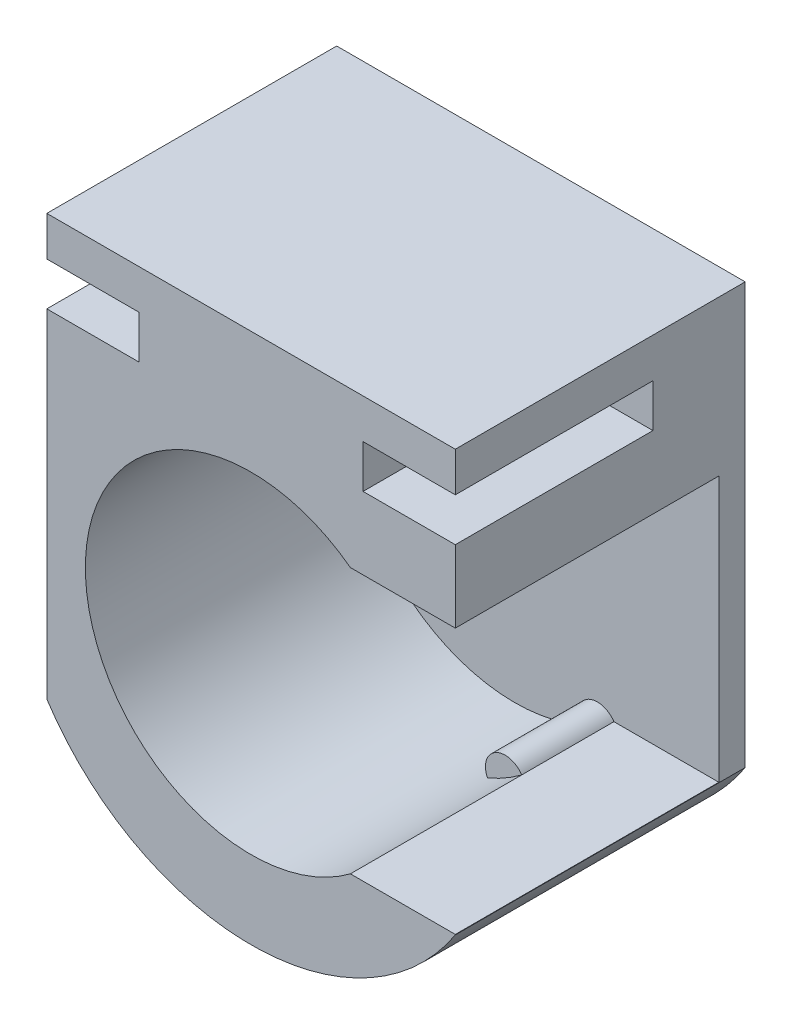
ISO-10303-21;
HEADER;
FILE_DESCRIPTION(('STEP AP214'),'2;1');
FILE_NAME('part.step','',(''),(''),'','','');
FILE_SCHEMA(('AUTOMOTIVE_DESIGN { 1 0 10303 214 1 1 1 1 }'));
ENDSEC;
DATA;
#1=APPLICATION_CONTEXT('core data for automotive mechanical design processes');
#2=APPLICATION_PROTOCOL_DEFINITION('international standard','automotive_design',2000,#1);
#3=PRODUCT_CONTEXT('',#1,'mechanical');
#4=PRODUCT('Part','Part','',(#3));
#5=PRODUCT_RELATED_PRODUCT_CATEGORY('part','',(#4));
#6=PRODUCT_DEFINITION_FORMATION('','',#4);
#7=PRODUCT_DEFINITION_CONTEXT('part definition',#1,'design');
#8=PRODUCT_DEFINITION('design','',#6,#7);
#9=PRODUCT_DEFINITION_SHAPE('','',#8);
#10=(LENGTH_UNIT() NAMED_UNIT(*) SI_UNIT(.MILLI.,.METRE.));
#11=(NAMED_UNIT(*) PLANE_ANGLE_UNIT() SI_UNIT($,.RADIAN.));
#12=(NAMED_UNIT(*) SI_UNIT($,.STERADIAN.) SOLID_ANGLE_UNIT());
#13=UNCERTAINTY_MEASURE_WITH_UNIT(LENGTH_MEASURE(1.E-05),#10,'distance_accuracy_value','');
#14=(GEOMETRIC_REPRESENTATION_CONTEXT(3) GLOBAL_UNCERTAINTY_ASSIGNED_CONTEXT((#13)) GLOBAL_UNIT_ASSIGNED_CONTEXT((#10,
#11,#12)) REPRESENTATION_CONTEXT('',''));
#15=CARTESIAN_POINT('',(0.,0.,0.));
#16=DIRECTION('',(0.,0.,1.));
#17=DIRECTION('',(1.,0.,0.));
#18=AXIS2_PLACEMENT_3D('',#15,#16,#17);
#19=CARTESIAN_POINT('',(0.,0.,15.));
#20=DIRECTION('',(0.,0.,-1.));
#21=DIRECTION('',(-1.,0.,0.));
#22=AXIS2_PLACEMENT_3D('',#19,#20,#21);
#23=CYLINDRICAL_SURFACE('',#22,12.575);
#24=CARTESIAN_POINT('',(0.,0.,2.));
#25=DIRECTION('',(0.,0.,1.));
#26=DIRECTION('',(1.,0.,0.));
#27=AXIS2_PLACEMENT_3D('',#24,#25,#26);
#28=CIRCLE('',#27,12.575);
#29=CARTESIAN_POINT('',(7.53949397709741,10.0641271638087,2.));
#30=VERTEX_POINT('',#29);
#31=CARTESIAN_POINT('',(4.94604280222658,11.5614568977505,2.));
#32=VERTEX_POINT('',#31);
#33=EDGE_CURVE('E42',#30,#32,#28,.T.);
#34=ORIENTED_EDGE('',*,*,#33,.F.);
#35=DIRECTION('',(0.,0.,1.));
#36=VECTOR('',#35,1.);
#37=CARTESIAN_POINT('',(7.53949397709741,10.0641271638087,-5.));
#38=LINE('',#37,#36);
#39=CARTESIAN_POINT('',(7.53949397709741,10.0641271638087,15.));
#40=VERTEX_POINT('',#39);
#41=EDGE_CURVE('E194',#30,#40,#38,.T.);
#42=ORIENTED_EDGE('',*,*,#41,.T.);
#43=CARTESIAN_POINT('',(0.,0.,15.));
#44=DIRECTION('',(0.,0.,1.));
#45=DIRECTION('',(1.,0.,0.));
#46=AXIS2_PLACEMENT_3D('',#43,#44,#45);
#47=CIRCLE('',#46,12.575);
#48=CARTESIAN_POINT('',(7.53949397709742,-10.0641271638087,15.));
#49=VERTEX_POINT('',#48);
#50=EDGE_CURVE('E301',#40,#49,#47,.T.);
#51=ORIENTED_EDGE('',*,*,#50,.T.);
#52=DIRECTION('',(0.,0.,1.));
#53=VECTOR('',#52,1.);
#54=CARTESIAN_POINT('',(7.53949397709742,-10.0641271638087,-5.));
#55=LINE('',#54,#53);
#56=CARTESIAN_POINT('',(7.53949397709742,-10.0641271638087,2.));
#57=VERTEX_POINT('',#56);
#58=EDGE_CURVE('E370',#57,#49,#55,.T.);
#59=ORIENTED_EDGE('',*,*,#58,.F.);
#60=CARTESIAN_POINT('',(0.,0.,2.));
#61=DIRECTION('',(0.,0.,1.));
#62=DIRECTION('',(1.,0.,0.));
#63=AXIS2_PLACEMENT_3D('',#60,#61,#62);
#64=CIRCLE('',#63,12.575);
#65=CARTESIAN_POINT('',(4.94604280222716,-11.5614568977503,2.));
#66=VERTEX_POINT('',#65);
#67=EDGE_CURVE('E11',#66,#57,#64,.T.);
#68=ORIENTED_EDGE('',*,*,#67,.F.);
#69=DIRECTION('',(0.,0.,-1.));
#70=VECTOR('',#69,1.);
#71=CARTESIAN_POINT('',(4.94604280222716,-11.5614568977503,-1.5));
#72=LINE('',#71,#70);
#73=CARTESIAN_POINT('',(4.94604280222716,-11.5614568977503,-5.));
#74=VERTEX_POINT('',#73);
#75=EDGE_CURVE('E215',#66,#74,#72,.T.);
#76=ORIENTED_EDGE('',*,*,#75,.T.);
#77=CARTESIAN_POINT('',(0.,0.,-5.));
#78=DIRECTION('',(0.,0.,-1.));
#79=DIRECTION('',(-1.,0.,0.));
#80=AXIS2_PLACEMENT_3D('',#77,#78,#79);
#81=CIRCLE('',#80,12.575);
#82=CARTESIAN_POINT('',(4.94604280222659,11.5614568977505,-5.));
#83=VERTEX_POINT('',#82);
#84=EDGE_CURVE('E254',#74,#83,#81,.T.);
#85=ORIENTED_EDGE('',*,*,#84,.T.);
#86=DIRECTION('',(0.,0.,-1.));
#87=VECTOR('',#86,1.);
#88=CARTESIAN_POINT('',(4.94604280222659,11.5614568977505,-1.5));
#89=LINE('',#88,#87);
#90=EDGE_CURVE('E201',#83,#32,#89,.F.);
#91=ORIENTED_EDGE('',*,*,#90,.T.);
#92=EDGE_LOOP('',(#34,#42,#51,#59,#68,#76,#85,#91));
#93=FACE_BOUND('',#92,.T.);
#94=ADVANCED_FACE('F34',(#93),#23,.F.);
#95=CARTESIAN_POINT('',(15.5,0.,15.));
#96=DIRECTION('',(-1.,0.,0.));
#97=DIRECTION('',(0.,0.,1.));
#98=AXIS2_PLACEMENT_3D('',#95,#96,#97);
#99=PLANE('',#98);
#100=DIRECTION('',(0.,0.,1.));
#101=VECTOR('',#100,1.);
#102=CARTESIAN_POINT('',(15.5,10.0641271638087,-5.));
#103=LINE('',#102,#101);
#104=CARTESIAN_POINT('',(15.5,10.0641271638087,-5.));
#105=VERTEX_POINT('',#104);
#106=CARTESIAN_POINT('',(15.5,10.0641271638087,15.));
#107=VERTEX_POINT('',#106);
#108=EDGE_CURVE('E367',#105,#107,#103,.T.);
#109=ORIENTED_EDGE('',*,*,#108,.F.);
#110=DIRECTION('',(0.,1.,0.));
#111=VECTOR('',#110,1.);
#112=CARTESIAN_POINT('',(15.5,0.,-5.));
#113=LINE('',#112,#111);
#114=CARTESIAN_POINT('',(15.5,-10.0641271638087,-5.));
#115=VERTEX_POINT('',#114);
#116=EDGE_CURVE('E209',#115,#105,#113,.T.);
#117=ORIENTED_EDGE('',*,*,#116,.F.);
#118=DIRECTION('',(0.,0.,1.));
#119=VECTOR('',#118,1.);
#120=CARTESIAN_POINT('',(15.5,-10.0641271638087,-5.));
#121=LINE('',#120,#119);
#122=CARTESIAN_POINT('',(15.5,-10.0641271638087,15.));
#123=VERTEX_POINT('',#122);
#124=EDGE_CURVE('E372',#115,#123,#121,.T.);
#125=ORIENTED_EDGE('',*,*,#124,.T.);
#126=DIRECTION('',(0.,1.,0.));
#127=VECTOR('',#126,1.);
#128=CARTESIAN_POINT('',(15.5,0.,15.));
#129=LINE('',#128,#127);
#130=CARTESIAN_POINT('',(15.5,-10.0995049383621,15.));
#131=VERTEX_POINT('',#130);
#132=EDGE_CURVE('E273',#131,#123,#129,.T.);
#133=ORIENTED_EDGE('',*,*,#132,.F.);
#134=DIRECTION('',(0.,0.,-1.));
#135=VECTOR('',#134,1.);
#136=CARTESIAN_POINT('',(15.5,-10.0995049383621,15.));
#137=LINE('',#136,#135);
#138=CARTESIAN_POINT('',(15.5,-10.0995049383621,-7.));
#139=VERTEX_POINT('',#138);
#140=EDGE_CURVE('E247',#131,#139,#137,.T.);
#141=ORIENTED_EDGE('',*,*,#140,.T.);
#142=DIRECTION('',(0.,-1.,0.));
#143=VECTOR('',#142,1.);
#144=CARTESIAN_POINT('',(15.5,0.,-7.));
#145=LINE('',#144,#143);
#146=CARTESIAN_POINT('',(15.5,21.825,-7.));
#147=VERTEX_POINT('',#146);
#148=EDGE_CURVE('E259',#147,#139,#145,.T.);
#149=ORIENTED_EDGE('',*,*,#148,.F.);
#150=DIRECTION('',(0.,0.,-1.));
#151=VECTOR('',#150,1.);
#152=CARTESIAN_POINT('',(15.5,21.825,15.));
#153=LINE('',#152,#151);
#154=CARTESIAN_POINT('',(15.5,21.825,15.));
#155=VERTEX_POINT('',#154);
#156=EDGE_CURVE('E331',#155,#147,#153,.T.);
#157=ORIENTED_EDGE('',*,*,#156,.F.);
#158=DIRECTION('',(0.,1.,0.));
#159=VECTOR('',#158,1.);
#160=CARTESIAN_POINT('',(15.5,0.,15.));
#161=LINE('',#160,#159);
#162=CARTESIAN_POINT('',(15.5,18.825,15.));
#163=VERTEX_POINT('',#162);
#164=EDGE_CURVE('E285',#163,#155,#161,.T.);
#165=ORIENTED_EDGE('',*,*,#164,.F.);
#166=DIRECTION('',(0.,0.,-1.));
#167=VECTOR('',#166,1.);
#168=CARTESIAN_POINT('',(15.5,18.825,15.));
#169=LINE('',#168,#167);
#170=CARTESIAN_POINT('',(15.5,18.825,0.));
#171=VERTEX_POINT('',#170);
#172=EDGE_CURVE('E333',#163,#171,#169,.T.);
#173=ORIENTED_EDGE('',*,*,#172,.T.);
#174=DIRECTION('',(0.,-1.,0.));
#175=VECTOR('',#174,1.);
#176=CARTESIAN_POINT('',(15.5,0.,0.));
#177=LINE('',#176,#175);
#178=CARTESIAN_POINT('',(15.5,15.55,0.));
#179=VERTEX_POINT('',#178);
#180=EDGE_CURVE('E258',#171,#179,#177,.T.);
#181=ORIENTED_EDGE('',*,*,#180,.T.);
#182=DIRECTION('',(0.,0.,-1.));
#183=VECTOR('',#182,1.);
#184=CARTESIAN_POINT('',(15.5,15.55,15.));
#185=LINE('',#184,#183);
#186=CARTESIAN_POINT('',(15.5,15.55,15.));
#187=VERTEX_POINT('',#186);
#188=EDGE_CURVE('E342',#187,#179,#185,.T.);
#189=ORIENTED_EDGE('',*,*,#188,.F.);
#190=EDGE_CURVE('E277',#107,#187,#129,.T.);
#191=ORIENTED_EDGE('',*,*,#190,.F.);
#192=EDGE_LOOP('',(#109,#117,#125,#133,#141,#149,#157,#165,#173,#181,#189,#191));
#193=FACE_BOUND('',#192,.T.);
#194=ADVANCED_FACE('F387',(#193),#99,.F.);
#195=CARTESIAN_POINT('',(0.,0.,15.));
#196=DIRECTION('',(0.,0.,1.));
#197=DIRECTION('',(1.,0.,0.));
#198=AXIS2_PLACEMENT_3D('',#195,#196,#197);
#199=PLANE('',#198);
#200=ORIENTED_EDGE('',*,*,#50,.F.);
#201=DIRECTION('',(1.,0.,0.));
#202=VECTOR('',#201,1.);
#203=CARTESIAN_POINT('',(0.,10.0641271638087,15.));
#204=LINE('',#203,#202);
#205=EDGE_CURVE('E377',#40,#107,#204,.T.);
#206=ORIENTED_EDGE('',*,*,#205,.T.);
#207=ORIENTED_EDGE('',*,*,#190,.T.);
#208=DIRECTION('',(-1.,0.,0.));
#209=VECTOR('',#208,1.);
#210=CARTESIAN_POINT('',(0.,15.55,15.));
#211=LINE('',#210,#209);
#212=CARTESIAN_POINT('',(8.5,15.55,15.));
#213=VERTEX_POINT('',#212);
#214=EDGE_CURVE('E276',#187,#213,#211,.T.);
#215=ORIENTED_EDGE('',*,*,#214,.T.);
#216=DIRECTION('',(0.,-1.,0.));
#217=VECTOR('',#216,1.);
#218=CARTESIAN_POINT('',(8.5,0.,15.));
#219=LINE('',#218,#217);
#220=CARTESIAN_POINT('',(8.5,18.825,15.));
#221=VERTEX_POINT('',#220);
#222=EDGE_CURVE('E279',#221,#213,#219,.T.);
#223=ORIENTED_EDGE('',*,*,#222,.F.);
#224=DIRECTION('',(1.,0.,0.));
#225=VECTOR('',#224,1.);
#226=CARTESIAN_POINT('',(0.,18.825,15.));
#227=LINE('',#226,#225);
#228=EDGE_CURVE('E283',#221,#163,#227,.T.);
#229=ORIENTED_EDGE('',*,*,#228,.T.);
#230=ORIENTED_EDGE('',*,*,#164,.T.);
#231=DIRECTION('',(1.,0.,0.));
#232=VECTOR('',#231,1.);
#233=CARTESIAN_POINT('',(0.,21.825,15.));
#234=LINE('',#233,#232);
#235=CARTESIAN_POINT('',(-15.5,21.825,15.));
#236=VERTEX_POINT('',#235);
#237=EDGE_CURVE('E287',#236,#155,#234,.T.);
#238=ORIENTED_EDGE('',*,*,#237,.F.);
#239=DIRECTION('',(0.,1.,0.));
#240=VECTOR('',#239,1.);
#241=CARTESIAN_POINT('',(-15.5,0.,15.));
#242=LINE('',#241,#240);
#243=CARTESIAN_POINT('',(-15.5,18.825,15.));
#244=VERTEX_POINT('',#243);
#245=EDGE_CURVE('E290',#244,#236,#242,.T.);
#246=ORIENTED_EDGE('',*,*,#245,.F.);
#247=DIRECTION('',(1.,0.,0.));
#248=VECTOR('',#247,1.);
#249=CARTESIAN_POINT('',(0.,18.825,15.));
#250=LINE('',#249,#248);
#251=CARTESIAN_POINT('',(-8.5,18.825,15.));
#252=VERTEX_POINT('',#251);
#253=EDGE_CURVE('E293',#244,#252,#250,.T.);
#254=ORIENTED_EDGE('',*,*,#253,.T.);
#255=DIRECTION('',(0.,1.,0.));
#256=VECTOR('',#255,1.);
#257=CARTESIAN_POINT('',(-8.5,0.,15.));
#258=LINE('',#257,#256);
#259=CARTESIAN_POINT('',(-8.5,15.55,15.));
#260=VERTEX_POINT('',#259);
#261=EDGE_CURVE('E295',#260,#252,#258,.T.);
#262=ORIENTED_EDGE('',*,*,#261,.F.);
#263=CARTESIAN_POINT('',(-15.5,15.55,15.));
#264=VERTEX_POINT('',#263);
#265=EDGE_CURVE('E280',#260,#264,#211,.T.);
#266=ORIENTED_EDGE('',*,*,#265,.T.);
#267=DIRECTION('',(0.,1.,0.));
#268=VECTOR('',#267,1.);
#269=CARTESIAN_POINT('',(-15.5,0.,15.));
#270=LINE('',#269,#268);
#271=CARTESIAN_POINT('',(-15.5,-10.0995049383621,15.));
#272=VERTEX_POINT('',#271);
#273=EDGE_CURVE('E298',#272,#264,#270,.T.);
#274=ORIENTED_EDGE('',*,*,#273,.F.);
#275=CARTESIAN_POINT('',(0.,0.,15.));
#276=DIRECTION('',(0.,0.,-1.));
#277=DIRECTION('',(-1.,0.,0.));
#278=AXIS2_PLACEMENT_3D('',#275,#276,#277);
#279=CIRCLE('',#278,18.5);
#280=EDGE_CURVE('E244',#131,#272,#279,.T.);
#281=ORIENTED_EDGE('',*,*,#280,.F.);
#282=ORIENTED_EDGE('',*,*,#132,.T.);
#283=DIRECTION('',(1.,0.,0.));
#284=VECTOR('',#283,1.);
#285=CARTESIAN_POINT('',(0.,-10.0641271638087,15.));
#286=LINE('',#285,#284);
#287=EDGE_CURVE('E211',#49,#123,#286,.T.);
#288=ORIENTED_EDGE('',*,*,#287,.F.);
#289=EDGE_LOOP('',(#200,#206,#207,#215,#223,#229,#230,#238,#246,#254,#262,#266,#274,#281,#282,#288));
#290=FACE_BOUND('',#289,.T.);
#291=ADVANCED_FACE('F383',(#290),#199,.T.);
#292=CARTESIAN_POINT('',(0.,0.,-7.));
#293=DIRECTION('',(0.,0.,-1.));
#294=DIRECTION('',(-1.,0.,0.));
#295=AXIS2_PLACEMENT_3D('',#292,#293,#294);
#296=PLANE('',#295);
#297=DIRECTION('',(-1.,0.,0.));
#298=VECTOR('',#297,1.);
#299=CARTESIAN_POINT('',(1.55,-15.4,-7.));
#300=LINE('',#299,#298);
#301=CARTESIAN_POINT('',(1.55,-15.4,-7.));
#302=VERTEX_POINT('',#301);
#303=CARTESIAN_POINT('',(-1.55,-15.4,-7.));
#304=VERTEX_POINT('',#303);
#305=EDGE_CURVE('E200',#302,#304,#300,.T.);
#306=ORIENTED_EDGE('',*,*,#305,.T.);
#307=DIRECTION('',(0.,-1.,0.));
#308=VECTOR('',#307,1.);
#309=CARTESIAN_POINT('',(-1.55,-15.4,-7.));
#310=LINE('',#309,#308);
#311=CARTESIAN_POINT('',(-1.55,-18.4349532139357,-7.));
#312=VERTEX_POINT('',#311);
#313=EDGE_CURVE('E235',#304,#312,#310,.T.);
#314=ORIENTED_EDGE('',*,*,#313,.T.);
#315=CARTESIAN_POINT('',(0.,0.,-7.));
#316=DIRECTION('',(0.,0.,-1.));
#317=DIRECTION('',(-1.,0.,0.));
#318=AXIS2_PLACEMENT_3D('',#315,#316,#317);
#319=CIRCLE('',#318,18.5);
#320=CARTESIAN_POINT('',(-15.5,-10.0995049383621,-7.));
#321=VERTEX_POINT('',#320);
#322=EDGE_CURVE('E243',#312,#321,#319,.T.);
#323=ORIENTED_EDGE('',*,*,#322,.T.);
#324=DIRECTION('',(0.,1.,0.));
#325=VECTOR('',#324,1.);
#326=CARTESIAN_POINT('',(-15.5,0.,-7.));
#327=LINE('',#326,#325);
#328=CARTESIAN_POINT('',(-15.5,21.825,-7.));
#329=VERTEX_POINT('',#328);
#330=EDGE_CURVE('E261',#321,#329,#327,.T.);
#331=ORIENTED_EDGE('',*,*,#330,.T.);
#332=DIRECTION('',(1.,0.,0.));
#333=VECTOR('',#332,1.);
#334=CARTESIAN_POINT('',(0.,21.825,-7.));
#335=LINE('',#334,#333);
#336=EDGE_CURVE('E265',#329,#147,#335,.T.);
#337=ORIENTED_EDGE('',*,*,#336,.T.);
#338=ORIENTED_EDGE('',*,*,#148,.T.);
#339=CARTESIAN_POINT('',(1.55,-18.4349532139357,-7.));
#340=VERTEX_POINT('',#339);
#341=EDGE_CURVE('E248',#139,#340,#319,.T.);
#342=ORIENTED_EDGE('',*,*,#341,.T.);
#343=DIRECTION('',(0.,-1.,0.));
#344=VECTOR('',#343,1.);
#345=CARTESIAN_POINT('',(1.55,-15.4,-7.));
#346=LINE('',#345,#344);
#347=EDGE_CURVE('E226',#302,#340,#346,.T.);
#348=ORIENTED_EDGE('',*,*,#347,.F.);
#349=EDGE_LOOP('',(#306,#314,#323,#331,#337,#338,#342,#348));
#350=FACE_BOUND('',#349,.T.);
#351=ADVANCED_FACE('F418',(#350),#296,.T.);
#352=CARTESIAN_POINT('',(0.,0.,15.));
#353=DIRECTION('',(0.,0.,-1.));
#354=DIRECTION('',(-1.,0.,0.));
#355=AXIS2_PLACEMENT_3D('',#352,#353,#354);
#356=CYLINDRICAL_SURFACE('',#355,18.5);
#357=ORIENTED_EDGE('',*,*,#322,.F.);
#358=DIRECTION('',(0.,0.,-1.));
#359=VECTOR('',#358,1.);
#360=CARTESIAN_POINT('',(-1.55,-18.4349532139357,15.));
#361=LINE('',#360,#359);
#362=CARTESIAN_POINT('',(-1.55,-18.4349532139357,-1.9));
#363=VERTEX_POINT('',#362);
#364=EDGE_CURVE('E350',#312,#363,#361,.F.);
#365=ORIENTED_EDGE('',*,*,#364,.T.);
#366=CARTESIAN_POINT('',(0.,0.,-1.9));
#367=DIRECTION('',(0.,0.,1.));
#368=DIRECTION('',(1.,0.,0.));
#369=AXIS2_PLACEMENT_3D('',#366,#367,#368);
#370=CIRCLE('',#369,18.5);
#371=CARTESIAN_POINT('',(1.55,-18.4349532139357,-1.9));
#372=VERTEX_POINT('',#371);
#373=EDGE_CURVE('E345',#372,#363,#370,.F.);
#374=ORIENTED_EDGE('',*,*,#373,.F.);
#375=DIRECTION('',(0.,0.,-1.));
#376=VECTOR('',#375,1.);
#377=CARTESIAN_POINT('',(1.55,-18.4349532139357,15.));
#378=LINE('',#377,#376);
#379=EDGE_CURVE('E347',#340,#372,#378,.F.);
#380=ORIENTED_EDGE('',*,*,#379,.F.);
#381=ORIENTED_EDGE('',*,*,#341,.F.);
#382=ORIENTED_EDGE('',*,*,#140,.F.);
#383=ORIENTED_EDGE('',*,*,#280,.T.);
#384=DIRECTION('',(0.,0.,-1.));
#385=VECTOR('',#384,1.);
#386=CARTESIAN_POINT('',(-15.5,-10.0995049383621,15.));
#387=LINE('',#386,#385);
#388=EDGE_CURVE('E251',#272,#321,#387,.T.);
#389=ORIENTED_EDGE('',*,*,#388,.T.);
#390=EDGE_LOOP('',(#357,#365,#374,#380,#381,#382,#383,#389));
#391=FACE_BOUND('',#390,.T.);
#392=ADVANCED_FACE('F424',(#391),#356,.T.);
#393=CARTESIAN_POINT('',(0.,15.55,15.));
#394=DIRECTION('',(0.,-1.,0.));
#395=DIRECTION('',(0.,0.,-1.));
#396=AXIS2_PLACEMENT_3D('',#393,#394,#395);
#397=PLANE('',#396);
#398=DIRECTION('',(-1.,0.,0.));
#399=VECTOR('',#398,1.);
#400=CARTESIAN_POINT('',(0.,15.55,0.));
#401=LINE('',#400,#399);
#402=CARTESIAN_POINT('',(8.5,15.55,0.));
#403=VERTEX_POINT('',#402);
#404=EDGE_CURVE('E268',#179,#403,#401,.T.);
#405=ORIENTED_EDGE('',*,*,#404,.T.);
#406=DIRECTION('',(0.,0.,-1.));
#407=VECTOR('',#406,1.);
#408=CARTESIAN_POINT('',(8.5,15.55,15.));
#409=LINE('',#408,#407);
#410=EDGE_CURVE('E339',#213,#403,#409,.T.);
#411=ORIENTED_EDGE('',*,*,#410,.F.);
#412=ORIENTED_EDGE('',*,*,#214,.F.);
#413=ORIENTED_EDGE('',*,*,#188,.T.);
#414=EDGE_LOOP('',(#405,#411,#412,#413));
#415=FACE_BOUND('',#414,.T.);
#416=ADVANCED_FACE('F460',(#415),#397,.F.);
#417=CARTESIAN_POINT('',(8.5,0.,15.));
#418=DIRECTION('',(1.,0.,0.));
#419=DIRECTION('',(0.,0.,-1.));
#420=AXIS2_PLACEMENT_3D('',#417,#418,#419);
#421=PLANE('',#420);
#422=DIRECTION('',(0.,-1.,0.));
#423=VECTOR('',#422,1.);
#424=CARTESIAN_POINT('',(8.5,0.,0.));
#425=LINE('',#424,#423);
#426=CARTESIAN_POINT('',(8.5,18.825,0.));
#427=VERTEX_POINT('',#426);
#428=EDGE_CURVE('E307',#427,#403,#425,.T.);
#429=ORIENTED_EDGE('',*,*,#428,.F.);
#430=DIRECTION('',(0.,0.,-1.));
#431=VECTOR('',#430,1.);
#432=CARTESIAN_POINT('',(8.5,18.825,15.));
#433=LINE('',#432,#431);
#434=EDGE_CURVE('E336',#221,#427,#433,.T.);
#435=ORIENTED_EDGE('',*,*,#434,.F.);
#436=ORIENTED_EDGE('',*,*,#222,.T.);
#437=ORIENTED_EDGE('',*,*,#410,.T.);
#438=EDGE_LOOP('',(#429,#435,#436,#437));
#439=FACE_BOUND('',#438,.T.);
#440=ADVANCED_FACE('F36',(#439),#421,.T.);
#441=CARTESIAN_POINT('',(0.,18.825,15.));
#442=DIRECTION('',(0.,1.,0.));
#443=DIRECTION('',(0.,0.,1.));
#444=AXIS2_PLACEMENT_3D('',#441,#442,#443);
#445=PLANE('',#444);
#446=DIRECTION('',(1.,0.,0.));
#447=VECTOR('',#446,1.);
#448=CARTESIAN_POINT('',(0.,18.825,0.));
#449=LINE('',#448,#447);
#450=EDGE_CURVE('E310',#427,#171,#449,.T.);
#451=ORIENTED_EDGE('',*,*,#450,.T.);
#452=ORIENTED_EDGE('',*,*,#172,.F.);
#453=ORIENTED_EDGE('',*,*,#228,.F.);
#454=ORIENTED_EDGE('',*,*,#434,.T.);
#455=EDGE_LOOP('',(#451,#452,#453,#454));
#456=FACE_BOUND('',#455,.T.);
#457=ADVANCED_FACE('F466',(#456),#445,.F.);
#458=CARTESIAN_POINT('',(0.,21.825,15.));
#459=DIRECTION('',(0.,1.,0.));
#460=DIRECTION('',(0.,0.,1.));
#461=AXIS2_PLACEMENT_3D('',#458,#459,#460);
#462=PLANE('',#461);
#463=ORIENTED_EDGE('',*,*,#156,.T.);
#464=ORIENTED_EDGE('',*,*,#336,.F.);
#465=DIRECTION('',(0.,0.,-1.));
#466=VECTOR('',#465,1.);
#467=CARTESIAN_POINT('',(-15.5,21.825,15.));
#468=LINE('',#467,#466);
#469=EDGE_CURVE('E329',#236,#329,#468,.T.);
#470=ORIENTED_EDGE('',*,*,#469,.F.);
#471=ORIENTED_EDGE('',*,*,#237,.T.);
#472=EDGE_LOOP('',(#463,#464,#470,#471));
#473=FACE_BOUND('',#472,.T.);
#474=ADVANCED_FACE('F414',(#473),#462,.T.);
#475=CARTESIAN_POINT('',(0.,18.825,15.));
#476=DIRECTION('',(0.,1.,0.));
#477=DIRECTION('',(0.,0.,1.));
#478=AXIS2_PLACEMENT_3D('',#475,#476,#477);
#479=PLANE('',#478);
#480=DIRECTION('',(1.,0.,0.));
#481=VECTOR('',#480,1.);
#482=CARTESIAN_POINT('',(0.,18.825,0.));
#483=LINE('',#482,#481);
#484=CARTESIAN_POINT('',(-15.5,18.825,0.));
#485=VERTEX_POINT('',#484);
#486=CARTESIAN_POINT('',(-8.5,18.825,0.));
#487=VERTEX_POINT('',#486);
#488=EDGE_CURVE('E313',#485,#487,#483,.T.);
#489=ORIENTED_EDGE('',*,*,#488,.T.);
#490=DIRECTION('',(0.,0.,-1.));
#491=VECTOR('',#490,1.);
#492=CARTESIAN_POINT('',(-8.5,18.825,15.));
#493=LINE('',#492,#491);
#494=EDGE_CURVE('E323',#252,#487,#493,.T.);
#495=ORIENTED_EDGE('',*,*,#494,.F.);
#496=ORIENTED_EDGE('',*,*,#253,.F.);
#497=DIRECTION('',(0.,0.,-1.));
#498=VECTOR('',#497,1.);
#499=CARTESIAN_POINT('',(-15.5,18.825,15.));
#500=LINE('',#499,#498);
#501=EDGE_CURVE('E326',#244,#485,#500,.T.);
#502=ORIENTED_EDGE('',*,*,#501,.T.);
#503=EDGE_LOOP('',(#489,#495,#496,#502));
#504=FACE_BOUND('',#503,.T.);
#505=ADVANCED_FACE('F409',(#504),#479,.F.);
#506=CARTESIAN_POINT('',(-8.5,0.,15.));
#507=DIRECTION('',(-1.,0.,0.));
#508=DIRECTION('',(0.,0.,1.));
#509=AXIS2_PLACEMENT_3D('',#506,#507,#508);
#510=PLANE('',#509);
#511=DIRECTION('',(0.,1.,0.));
#512=VECTOR('',#511,1.);
#513=CARTESIAN_POINT('',(-8.5,0.,0.));
#514=LINE('',#513,#512);
#515=CARTESIAN_POINT('',(-8.5,15.55,0.));
#516=VERTEX_POINT('',#515);
#517=EDGE_CURVE('E316',#516,#487,#514,.T.);
#518=ORIENTED_EDGE('',*,*,#517,.F.);
#519=DIRECTION('',(0.,0.,-1.));
#520=VECTOR('',#519,1.);
#521=CARTESIAN_POINT('',(-8.5,15.55,15.));
#522=LINE('',#521,#520);
#523=EDGE_CURVE('E320',#260,#516,#522,.T.);
#524=ORIENTED_EDGE('',*,*,#523,.F.);
#525=ORIENTED_EDGE('',*,*,#261,.T.);
#526=ORIENTED_EDGE('',*,*,#494,.T.);
#527=EDGE_LOOP('',(#518,#524,#525,#526));
#528=FACE_BOUND('',#527,.T.);
#529=ADVANCED_FACE('F407',(#528),#510,.T.);
#530=CARTESIAN_POINT('',(-15.5,15.55,0.));
#531=VERTEX_POINT('',#530);
#532=EDGE_CURVE('E308',#516,#531,#401,.T.);
#533=ORIENTED_EDGE('',*,*,#532,.T.);
#534=DIRECTION('',(0.,0.,-1.));
#535=VECTOR('',#534,1.);
#536=CARTESIAN_POINT('',(-15.5,15.55,15.));
#537=LINE('',#536,#535);
#538=EDGE_CURVE('E304',#264,#531,#537,.T.);
#539=ORIENTED_EDGE('',*,*,#538,.F.);
#540=ORIENTED_EDGE('',*,*,#265,.F.);
#541=ORIENTED_EDGE('',*,*,#523,.T.);
#542=EDGE_LOOP('',(#533,#539,#540,#541));
#543=FACE_BOUND('',#542,.T.);
#544=ADVANCED_FACE('F392',(#543),#397,.F.);
#545=CARTESIAN_POINT('',(-15.5,0.,15.));
#546=DIRECTION('',(-1.,0.,0.));
#547=DIRECTION('',(0.,0.,1.));
#548=AXIS2_PLACEMENT_3D('',#545,#546,#547);
#549=PLANE('',#548);
#550=ORIENTED_EDGE('',*,*,#538,.T.);
#551=DIRECTION('',(0.,1.,0.));
#552=VECTOR('',#551,1.);
#553=CARTESIAN_POINT('',(-15.5,0.,0.));
#554=LINE('',#553,#552);
#555=EDGE_CURVE('E262',#531,#485,#554,.T.);
#556=ORIENTED_EDGE('',*,*,#555,.T.);
#557=ORIENTED_EDGE('',*,*,#501,.F.);
#558=ORIENTED_EDGE('',*,*,#245,.T.);
#559=ORIENTED_EDGE('',*,*,#469,.T.);
#560=ORIENTED_EDGE('',*,*,#330,.F.);
#561=ORIENTED_EDGE('',*,*,#388,.F.);
#562=ORIENTED_EDGE('',*,*,#273,.T.);
#563=EDGE_LOOP('',(#550,#556,#557,#558,#559,#560,#561,#562));
#564=FACE_BOUND('',#563,.T.);
#565=ADVANCED_FACE('F398',(#564),#549,.T.);
#566=CARTESIAN_POINT('',(0.,0.,0.));
#567=DIRECTION('',(0.,0.,-1.));
#568=DIRECTION('',(-1.,0.,0.));
#569=AXIS2_PLACEMENT_3D('',#566,#567,#568);
#570=PLANE('',#569);
#571=ORIENTED_EDGE('',*,*,#532,.F.);
#572=ORIENTED_EDGE('',*,*,#517,.T.);
#573=ORIENTED_EDGE('',*,*,#488,.F.);
#574=ORIENTED_EDGE('',*,*,#555,.F.);
#575=EDGE_LOOP('',(#571,#572,#573,#574));
#576=FACE_BOUND('',#575,.T.);
#577=ADVANCED_FACE('F396',(#576),#570,.F.);
#578=ORIENTED_EDGE('',*,*,#450,.F.);
#579=ORIENTED_EDGE('',*,*,#428,.T.);
#580=ORIENTED_EDGE('',*,*,#404,.F.);
#581=ORIENTED_EDGE('',*,*,#180,.F.);
#582=EDGE_LOOP('',(#578,#579,#580,#581));
#583=FACE_BOUND('',#582,.T.);
#584=ADVANCED_FACE('F480',(#583),#570,.F.);
#585=CARTESIAN_POINT('',(0.,0.,-5.));
#586=DIRECTION('',(0.,0.,-1.));
#587=DIRECTION('',(-1.,0.,0.));
#588=AXIS2_PLACEMENT_3D('',#585,#586,#587);
#589=PLANE('',#588);
#590=CARTESIAN_POINT('',(6.28750000000037,-10.89026945259,-5.));
#591=DIRECTION('',(0.,0.,1.));
#592=DIRECTION('',(1.,0.,0.));
#593=AXIS2_PLACEMENT_3D('',#590,#591,#592);
#594=CIRCLE('',#593,1.49999999999943);
#595=CARTESIAN_POINT('',(7.53949397709693,-10.064127163809,-5.));
#596=VERTEX_POINT('',#595);
#597=EDGE_CURVE('E357',#596,#74,#594,.T.);
#598=ORIENTED_EDGE('',*,*,#597,.F.);
#599=DIRECTION('',(1.,0.,0.));
#600=VECTOR('',#599,1.);
#601=CARTESIAN_POINT('',(0.,-10.0641271638087,-5.));
#602=LINE('',#601,#600);
#603=EDGE_CURVE('E55',#596,#115,#602,.T.);
#604=ORIENTED_EDGE('',*,*,#603,.T.);
#605=ORIENTED_EDGE('',*,*,#116,.T.);
#606=DIRECTION('',(1.,0.,0.));
#607=VECTOR('',#606,1.);
#608=CARTESIAN_POINT('',(0.,10.0641271638087,-5.));
#609=LINE('',#608,#607);
#610=CARTESIAN_POINT('',(7.53949397709741,10.0641271638087,-5.));
#611=VERTEX_POINT('',#610);
#612=EDGE_CURVE('E191',#611,#105,#609,.T.);
#613=ORIENTED_EDGE('',*,*,#612,.F.);
#614=CARTESIAN_POINT('',(6.28749999999997,10.8902694525893,-5.));
#615=DIRECTION('',(0.,0.,1.));
#616=DIRECTION('',(1.,0.,0.));
#617=AXIS2_PLACEMENT_3D('',#614,#615,#616);
#618=CIRCLE('',#617,1.5);
#619=EDGE_CURVE('E206',#83,#611,#618,.T.);
#620=ORIENTED_EDGE('',*,*,#619,.F.);
#621=ORIENTED_EDGE('',*,*,#84,.F.);
#622=EDGE_LOOP('',(#598,#604,#605,#613,#620,#621));
#623=FACE_BOUND('',#622,.T.);
#624=ADVANCED_FACE('F205',(#623),#589,.F.);
#625=CARTESIAN_POINT('',(1.55,-15.4,-1.9));
#626=DIRECTION('',(0.,-1.,0.));
#627=DIRECTION('',(0.,0.,-1.));
#628=AXIS2_PLACEMENT_3D('',#625,#626,#627);
#629=PLANE('',#628);
#630=ORIENTED_EDGE('',*,*,#305,.F.);
#631=DIRECTION('',(0.,0.,-1.));
#632=VECTOR('',#631,1.);
#633=CARTESIAN_POINT('',(1.55,-15.4,-1.9));
#634=LINE('',#633,#632);
#635=CARTESIAN_POINT('',(1.55,-15.4,-1.9));
#636=VERTEX_POINT('',#635);
#637=EDGE_CURVE('E232',#636,#302,#634,.T.);
#638=ORIENTED_EDGE('',*,*,#637,.F.);
#639=DIRECTION('',(-1.,0.,0.));
#640=VECTOR('',#639,1.);
#641=CARTESIAN_POINT('',(1.55,-15.4,-1.9));
#642=LINE('',#641,#640);
#643=CARTESIAN_POINT('',(-1.55,-15.4,-1.9));
#644=VERTEX_POINT('',#643);
#645=EDGE_CURVE('E222',#636,#644,#642,.T.);
#646=ORIENTED_EDGE('',*,*,#645,.T.);
#647=DIRECTION('',(0.,0.,-1.));
#648=VECTOR('',#647,1.);
#649=CARTESIAN_POINT('',(-1.55,-15.4,-1.9));
#650=LINE('',#649,#648);
#651=EDGE_CURVE('E240',#644,#304,#650,.T.);
#652=ORIENTED_EDGE('',*,*,#651,.T.);
#653=EDGE_LOOP('',(#630,#638,#646,#652));
#654=FACE_BOUND('',#653,.T.);
#655=ADVANCED_FACE('F432',(#654),#629,.T.);
#656=CARTESIAN_POINT('',(-1.55,-15.4,-1.9));
#657=DIRECTION('',(1.,0.,0.));
#658=DIRECTION('',(0.,0.,-1.));
#659=AXIS2_PLACEMENT_3D('',#656,#657,#658);
#660=PLANE('',#659);
#661=ORIENTED_EDGE('',*,*,#313,.F.);
#662=ORIENTED_EDGE('',*,*,#651,.F.);
#663=DIRECTION('',(0.,-1.,0.));
#664=VECTOR('',#663,1.);
#665=CARTESIAN_POINT('',(-1.55,-15.4,-1.9));
#666=LINE('',#665,#664);
#667=EDGE_CURVE('E225',#644,#363,#666,.T.);
#668=ORIENTED_EDGE('',*,*,#667,.T.);
#669=ORIENTED_EDGE('',*,*,#364,.F.);
#670=EDGE_LOOP('',(#661,#662,#668,#669));
#671=FACE_BOUND('',#670,.T.);
#672=ADVANCED_FACE('F435',(#671),#660,.T.);
#673=CARTESIAN_POINT('',(1.55,-15.4,-1.9));
#674=DIRECTION('',(1.,0.,0.));
#675=DIRECTION('',(0.,1.,0.));
#676=AXIS2_PLACEMENT_3D('',#673,#674,#675);
#677=PLANE('',#676);
#678=ORIENTED_EDGE('',*,*,#379,.T.);
#679=DIRECTION('',(0.,-1.,0.));
#680=VECTOR('',#679,1.);
#681=CARTESIAN_POINT('',(1.55,-15.4,-1.9));
#682=LINE('',#681,#680);
#683=EDGE_CURVE('E229',#636,#372,#682,.T.);
#684=ORIENTED_EDGE('',*,*,#683,.F.);
#685=ORIENTED_EDGE('',*,*,#637,.T.);
#686=ORIENTED_EDGE('',*,*,#347,.T.);
#687=EDGE_LOOP('',(#678,#684,#685,#686));
#688=FACE_BOUND('',#687,.T.);
#689=ADVANCED_FACE('F428',(#688),#677,.F.);
#690=CARTESIAN_POINT('',(0.,0.,-1.9));
#691=DIRECTION('',(0.,0.,1.));
#692=DIRECTION('',(1.,0.,0.));
#693=AXIS2_PLACEMENT_3D('',#690,#691,#692);
#694=PLANE('',#693);
#695=ORIENTED_EDGE('',*,*,#683,.T.);
#696=ORIENTED_EDGE('',*,*,#373,.T.);
#697=ORIENTED_EDGE('',*,*,#667,.F.);
#698=ORIENTED_EDGE('',*,*,#645,.F.);
#699=EDGE_LOOP('',(#695,#696,#697,#698));
#700=FACE_BOUND('',#699,.T.);
#701=ADVANCED_FACE('F437',(#700),#694,.F.);
#702=CARTESIAN_POINT('',(6.28749999999997,10.8902694525893,2.));
#703=DIRECTION('',(0.,0.,1.));
#704=DIRECTION('',(1.,0.,0.));
#705=AXIS2_PLACEMENT_3D('',#702,#703,#704);
#706=PLANE('',#705);
#707=CARTESIAN_POINT('',(6.28749999999997,10.8902694525893,2.));
#708=DIRECTION('',(0.,0.,1.));
#709=DIRECTION('',(1.,0.,0.));
#710=AXIS2_PLACEMENT_3D('',#707,#708,#709);
#711=CIRCLE('',#710,1.5);
#712=EDGE_CURVE('E214',#32,#30,#711,.T.);
#713=ORIENTED_EDGE('',*,*,#712,.T.);
#714=ORIENTED_EDGE('',*,*,#33,.T.);
#715=EDGE_LOOP('',(#713,#714));
#716=FACE_BOUND('',#715,.T.);
#717=ADVANCED_FACE('F354',(#716),#706,.T.);
#718=CARTESIAN_POINT('',(6.28749999999997,10.8902694525893,2.));
#719=DIRECTION('',(0.,0.,-1.));
#720=DIRECTION('',(-1.,0.,0.));
#721=AXIS2_PLACEMENT_3D('',#718,#719,#720);
#722=CYLINDRICAL_SURFACE('',#721,1.5);
#723=DIRECTION('',(0.,0.,-1.));
#724=VECTOR('',#723,1.);
#725=CARTESIAN_POINT('',(7.53949397709741,10.0641271638087,-1.5));
#726=LINE('',#725,#724);
#727=EDGE_CURVE('E188',#30,#611,#726,.T.);
#728=ORIENTED_EDGE('',*,*,#727,.F.);
#729=ORIENTED_EDGE('',*,*,#712,.F.);
#730=ORIENTED_EDGE('',*,*,#90,.F.);
#731=ORIENTED_EDGE('',*,*,#619,.T.);
#732=EDGE_LOOP('',(#728,#729,#730,#731));
#733=FACE_BOUND('',#732,.T.);
#734=ADVANCED_FACE('F213',(#733),#722,.T.);
#735=CARTESIAN_POINT('',(6.28750000000037,-10.89026945259,2.));
#736=DIRECTION('',(0.,0.,1.));
#737=DIRECTION('',(1.,0.,0.));
#738=AXIS2_PLACEMENT_3D('',#735,#736,#737);
#739=PLANE('',#738);
#740=CARTESIAN_POINT('',(6.28750000000037,-10.89026945259,2.));
#741=DIRECTION('',(0.,0.,1.));
#742=DIRECTION('',(1.,0.,0.));
#743=AXIS2_PLACEMENT_3D('',#740,#741,#742);
#744=CIRCLE('',#743,1.49999999999943);
#745=EDGE_CURVE('E360',#57,#66,#744,.T.);
#746=ORIENTED_EDGE('',*,*,#745,.T.);
#747=ORIENTED_EDGE('',*,*,#67,.T.);
#748=EDGE_LOOP('',(#746,#747));
#749=FACE_BOUND('',#748,.T.);
#750=ADVANCED_FACE('F551',(#749),#739,.T.);
#751=CARTESIAN_POINT('',(6.28750000000037,-10.89026945259,2.));
#752=DIRECTION('',(0.,0.,-1.));
#753=DIRECTION('',(-1.,0.,0.));
#754=AXIS2_PLACEMENT_3D('',#751,#752,#753);
#755=CYLINDRICAL_SURFACE('',#754,1.49999999999943);
#756=ORIENTED_EDGE('',*,*,#75,.F.);
#757=ORIENTED_EDGE('',*,*,#745,.F.);
#758=DIRECTION('',(0.,0.,-1.));
#759=VECTOR('',#758,1.);
#760=CARTESIAN_POINT('',(7.53949397709693,-10.064127163809,-1.5));
#761=LINE('',#760,#759);
#762=EDGE_CURVE('E218',#596,#57,#761,.F.);
#763=ORIENTED_EDGE('',*,*,#762,.F.);
#764=ORIENTED_EDGE('',*,*,#597,.T.);
#765=EDGE_LOOP('',(#756,#757,#763,#764));
#766=FACE_BOUND('',#765,.T.);
#767=ADVANCED_FACE('F363',(#766),#755,.T.);
#768=CARTESIAN_POINT('',(0.,10.0641271638087,-5.));
#769=DIRECTION('',(0.,-1.,0.));
#770=DIRECTION('',(0.,0.,-1.));
#771=AXIS2_PLACEMENT_3D('',#768,#769,#770);
#772=PLANE('',#771);
#773=ORIENTED_EDGE('',*,*,#205,.F.);
#774=ORIENTED_EDGE('',*,*,#41,.F.);
#775=ORIENTED_EDGE('',*,*,#727,.T.);
#776=ORIENTED_EDGE('',*,*,#612,.T.);
#777=ORIENTED_EDGE('',*,*,#108,.T.);
#778=EDGE_LOOP('',(#773,#774,#775,#776,#777));
#779=FACE_BOUND('',#778,.T.);
#780=ADVANCED_FACE('F190',(#779),#772,.T.);
#781=CARTESIAN_POINT('',(0.,-10.0641271638087,-5.));
#782=DIRECTION('',(0.,-1.,0.));
#783=DIRECTION('',(0.,0.,-1.));
#784=AXIS2_PLACEMENT_3D('',#781,#782,#783);
#785=PLANE('',#784);
#786=ORIENTED_EDGE('',*,*,#287,.T.);
#787=ORIENTED_EDGE('',*,*,#124,.F.);
#788=ORIENTED_EDGE('',*,*,#603,.F.);
#789=ORIENTED_EDGE('',*,*,#762,.T.);
#790=ORIENTED_EDGE('',*,*,#58,.T.);
#791=EDGE_LOOP('',(#786,#787,#788,#789,#790));
#792=FACE_BOUND('',#791,.T.);
#793=ADVANCED_FACE('F576',(#792),#785,.F.);
#794=CLOSED_SHELL('',(#94,#194,#291,#351,#392,#416,#440,#457,#474,#505,#529,#544,#565,#577,#584,
#624,#655,#672,#689,#701,#717,#734,#750,#767,#780,#793));
#795=MANIFOLD_SOLID_BREP('B2',#794);
#796=ADVANCED_BREP_SHAPE_REPRESENTATION('',(#18,#795),#14);
#797=SHAPE_DEFINITION_REPRESENTATION(#9,#796);
ENDSEC;
END-ISO-10303-21;
